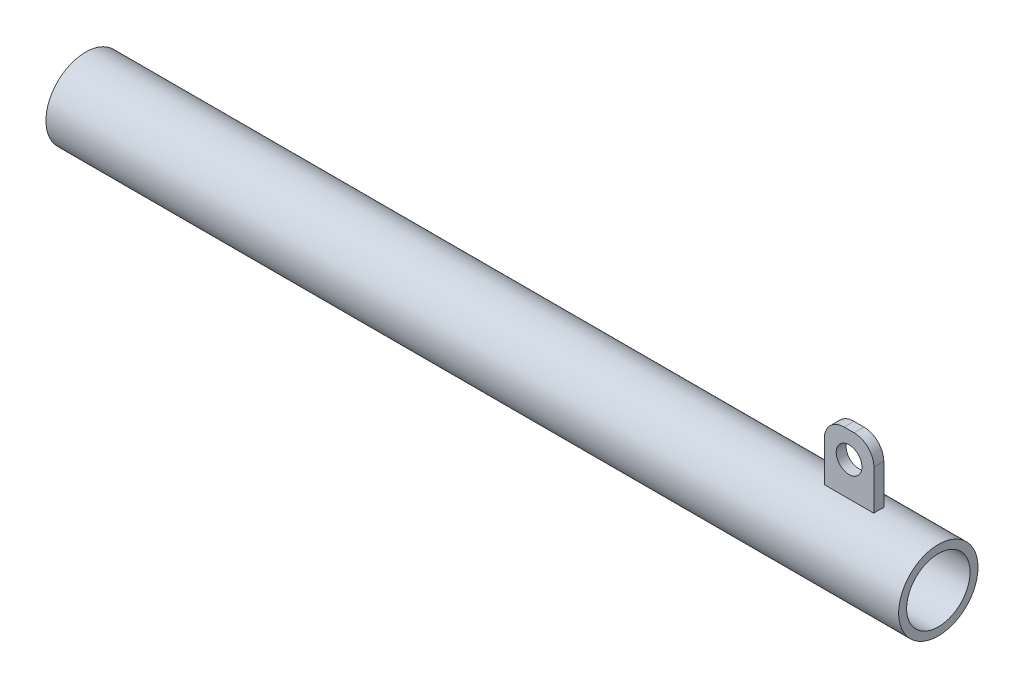
ISO-10303-21;
HEADER;
FILE_DESCRIPTION(('STEP AP214'),'2;1');
FILE_NAME('part.step','',(''),(''),'','','');
FILE_SCHEMA(('AUTOMOTIVE_DESIGN { 1 0 10303 214 1 1 1 1 }'));
ENDSEC;
DATA;
#1=APPLICATION_CONTEXT('core data for automotive mechanical design processes');
#2=APPLICATION_PROTOCOL_DEFINITION('international standard','automotive_design',2000,#1);
#3=PRODUCT_CONTEXT('',#1,'mechanical');
#4=PRODUCT('Part','Part','',(#3));
#5=PRODUCT_RELATED_PRODUCT_CATEGORY('part','',(#4));
#6=PRODUCT_DEFINITION_FORMATION('','',#4);
#7=PRODUCT_DEFINITION_CONTEXT('part definition',#1,'design');
#8=PRODUCT_DEFINITION('design','',#6,#7);
#9=PRODUCT_DEFINITION_SHAPE('','',#8);
#10=(LENGTH_UNIT() NAMED_UNIT(*) SI_UNIT(.MILLI.,.METRE.));
#11=(NAMED_UNIT(*) PLANE_ANGLE_UNIT() SI_UNIT($,.RADIAN.));
#12=(NAMED_UNIT(*) SI_UNIT($,.STERADIAN.) SOLID_ANGLE_UNIT());
#13=UNCERTAINTY_MEASURE_WITH_UNIT(LENGTH_MEASURE(1.E-05),#10,'distance_accuracy_value','');
#14=(GEOMETRIC_REPRESENTATION_CONTEXT(3) GLOBAL_UNCERTAINTY_ASSIGNED_CONTEXT((#13)) GLOBAL_UNIT_ASSIGNED_CONTEXT((#10,
#11,#12)) REPRESENTATION_CONTEXT('',''));
#15=CARTESIAN_POINT('',(0.,0.,0.));
#16=DIRECTION('',(0.,0.,1.));
#17=DIRECTION('',(1.,0.,0.));
#18=AXIS2_PLACEMENT_3D('',#15,#16,#17);
#19=CARTESIAN_POINT('',(-430.,0.,0.));
#20=DIRECTION('',(1.,0.,0.));
#21=DIRECTION('',(0.,0.,-1.));
#22=AXIS2_PLACEMENT_3D('',#19,#20,#21);
#23=CYLINDRICAL_SURFACE('',#22,20.);
#24=DIRECTION('',(1.,0.,0.));
#25=VECTOR('',#24,1.);
#26=CARTESIAN_POINT('',(-430.,19.8431348329844,-2.50000000000007));
#27=LINE('',#26,#25);
#28=CARTESIAN_POINT('',(-55.,19.8431348329844,-2.5));
#29=VERTEX_POINT('',#28);
#30=CARTESIAN_POINT('',(-30.,19.8431348329844,-2.50000000000007));
#31=VERTEX_POINT('',#30);
#32=EDGE_CURVE('E93',#29,#31,#27,.T.);
#33=ORIENTED_EDGE('',*,*,#32,.T.);
#34=CARTESIAN_POINT('',(-30.,0.,0.));
#35=DIRECTION('',(1.,0.,0.));
#36=DIRECTION('',(0.,0.,-1.));
#37=AXIS2_PLACEMENT_3D('',#34,#35,#36);
#38=CIRCLE('',#37,20.);
#39=CARTESIAN_POINT('',(-30.,19.8431348329844,2.49999999999993));
#40=VERTEX_POINT('',#39);
#41=EDGE_CURVE('E87',#31,#40,#38,.T.);
#42=ORIENTED_EDGE('',*,*,#41,.T.);
#43=DIRECTION('',(1.,0.,0.));
#44=VECTOR('',#43,1.);
#45=CARTESIAN_POINT('',(-430.,19.8431348329844,2.49999999999993));
#46=LINE('',#45,#44);
#47=CARTESIAN_POINT('',(-55.,19.8431348329844,2.49999999999993));
#48=VERTEX_POINT('',#47);
#49=EDGE_CURVE('E90',#40,#48,#46,.F.);
#50=ORIENTED_EDGE('',*,*,#49,.T.);
#51=CARTESIAN_POINT('',(-55.,0.,0.));
#52=DIRECTION('',(-1.,0.,0.));
#53=DIRECTION('',(0.,0.,1.));
#54=AXIS2_PLACEMENT_3D('',#51,#52,#53);
#55=CIRCLE('',#54,20.);
#56=EDGE_CURVE('E101',#48,#29,#55,.T.);
#57=ORIENTED_EDGE('',*,*,#56,.T.);
#58=EDGE_LOOP('',(#33,#42,#50,#57));
#59=FACE_BOUND('',#58,.T.);
#60=CARTESIAN_POINT('',(-430.,0.,0.));
#61=DIRECTION('',(1.,0.,0.));
#62=DIRECTION('',(0.,0.,-1.));
#63=AXIS2_PLACEMENT_3D('',#60,#61,#62);
#64=CIRCLE('',#63,20.);
#65=CARTESIAN_POINT('',(-430.,0.,-20.));
#66=VERTEX_POINT('',#65);
#67=EDGE_CURVE('E126',#66,#66,#64,.T.);
#68=ORIENTED_EDGE('',*,*,#67,.T.);
#69=EDGE_LOOP('',(#68));
#70=FACE_BOUND('',#69,.T.);
#71=CARTESIAN_POINT('',(0.,0.,0.));
#72=DIRECTION('',(1.,0.,0.));
#73=DIRECTION('',(0.,0.,-1.));
#74=AXIS2_PLACEMENT_3D('',#71,#72,#73);
#75=CIRCLE('',#74,20.);
#76=CARTESIAN_POINT('',(0.,0.,-20.));
#77=VERTEX_POINT('',#76);
#78=EDGE_CURVE('E123',#77,#77,#75,.T.);
#79=ORIENTED_EDGE('',*,*,#78,.F.);
#80=EDGE_LOOP('',(#79));
#81=FACE_BOUND('',#80,.T.);
#82=ADVANCED_FACE('F33',(#59,#70,#81),#23,.T.);
#83=CARTESIAN_POINT('',(-430.,0.,0.));
#84=DIRECTION('',(1.,0.,0.));
#85=DIRECTION('',(0.,0.,-1.));
#86=AXIS2_PLACEMENT_3D('',#83,#84,#85);
#87=PLANE('',#86);
#88=CARTESIAN_POINT('',(-430.,0.,0.));
#89=DIRECTION('',(1.,0.,0.));
#90=DIRECTION('',(0.,0.,-1.));
#91=AXIS2_PLACEMENT_3D('',#88,#89,#90);
#92=CIRCLE('',#91,16.);
#93=CARTESIAN_POINT('',(-430.,0.,-16.));
#94=VERTEX_POINT('',#93);
#95=EDGE_CURVE('E120',#94,#94,#92,.T.);
#96=ORIENTED_EDGE('',*,*,#95,.T.);
#97=EDGE_LOOP('',(#96));
#98=FACE_BOUND('',#97,.T.);
#99=ORIENTED_EDGE('',*,*,#67,.F.);
#100=EDGE_LOOP('',(#99));
#101=FACE_BOUND('',#100,.T.);
#102=ADVANCED_FACE('F169',(#98,#101),#87,.F.);
#103=CARTESIAN_POINT('',(0.,0.,0.));
#104=DIRECTION('',(1.,0.,0.));
#105=DIRECTION('',(0.,0.,-1.));
#106=AXIS2_PLACEMENT_3D('',#103,#104,#105);
#107=PLANE('',#106);
#108=CARTESIAN_POINT('',(0.,0.,0.));
#109=DIRECTION('',(1.,0.,0.));
#110=DIRECTION('',(0.,0.,-1.));
#111=AXIS2_PLACEMENT_3D('',#108,#109,#110);
#112=CIRCLE('',#111,16.);
#113=CARTESIAN_POINT('',(0.,0.,-16.));
#114=VERTEX_POINT('',#113);
#115=EDGE_CURVE('E118',#114,#114,#112,.T.);
#116=ORIENTED_EDGE('',*,*,#115,.F.);
#117=EDGE_LOOP('',(#116));
#118=FACE_BOUND('',#117,.T.);
#119=ORIENTED_EDGE('',*,*,#78,.T.);
#120=EDGE_LOOP('',(#119));
#121=FACE_BOUND('',#120,.T.);
#122=ADVANCED_FACE('F176',(#118,#121),#107,.T.);
#123=CARTESIAN_POINT('',(-430.,0.,0.));
#124=DIRECTION('',(1.,0.,0.));
#125=DIRECTION('',(0.,0.,-1.));
#126=AXIS2_PLACEMENT_3D('',#123,#124,#125);
#127=CYLINDRICAL_SURFACE('',#126,16.);
#128=ORIENTED_EDGE('',*,*,#95,.F.);
#129=EDGE_LOOP('',(#128));
#130=FACE_BOUND('',#129,.T.);
#131=ORIENTED_EDGE('',*,*,#115,.T.);
#132=EDGE_LOOP('',(#131));
#133=FACE_BOUND('',#132,.T.);
#134=ADVANCED_FACE('F166',(#130,#133),#127,.F.);
#135=CARTESIAN_POINT('',(-30.,-20.001,-2.5));
#136=DIRECTION('',(1.,0.,0.));
#137=DIRECTION('',(0.,0.,-1.));
#138=AXIS2_PLACEMENT_3D('',#135,#136,#137);
#139=PLANE('',#138);
#140=DIRECTION('',(0.,1.,0.));
#141=VECTOR('',#140,1.);
#142=CARTESIAN_POINT('',(-30.,-20.001,-2.5));
#143=LINE('',#142,#141);
#144=CARTESIAN_POINT('',(-30.,40.,-2.5));
#145=VERTEX_POINT('',#144);
#146=EDGE_CURVE('E113',#31,#145,#143,.T.);
#147=ORIENTED_EDGE('',*,*,#146,.T.);
#148=DIRECTION('',(0.,0.,-1.));
#149=VECTOR('',#148,1.);
#150=CARTESIAN_POINT('',(-30.,40.,-2.5));
#151=LINE('',#150,#149);
#152=CARTESIAN_POINT('',(-30.,40.,2.5));
#153=VERTEX_POINT('',#152);
#154=EDGE_CURVE('E56',#145,#153,#151,.F.);
#155=ORIENTED_EDGE('',*,*,#154,.T.);
#156=DIRECTION('',(0.,1.,0.));
#157=VECTOR('',#156,1.);
#158=CARTESIAN_POINT('',(-30.,-20.001,2.5));
#159=LINE('',#158,#157);
#160=EDGE_CURVE('E98',#40,#153,#159,.T.);
#161=ORIENTED_EDGE('',*,*,#160,.F.);
#162=ORIENTED_EDGE('',*,*,#41,.F.);
#163=EDGE_LOOP('',(#147,#155,#161,#162));
#164=FACE_BOUND('',#163,.T.);
#165=ADVANCED_FACE('F103',(#164),#139,.T.);
#166=CARTESIAN_POINT('',(-55.,-20.001,-2.5));
#167=DIRECTION('',(-1.,0.,0.));
#168=DIRECTION('',(0.,0.,1.));
#169=AXIS2_PLACEMENT_3D('',#166,#167,#168);
#170=PLANE('',#169);
#171=DIRECTION('',(0.,1.,0.));
#172=VECTOR('',#171,1.);
#173=CARTESIAN_POINT('',(-55.,-20.001,2.5));
#174=LINE('',#173,#172);
#175=CARTESIAN_POINT('',(-55.,40.,2.5));
#176=VERTEX_POINT('',#175);
#177=EDGE_CURVE('E100',#48,#176,#174,.T.);
#178=ORIENTED_EDGE('',*,*,#177,.T.);
#179=DIRECTION('',(0.,0.,1.));
#180=VECTOR('',#179,1.);
#181=CARTESIAN_POINT('',(-55.,40.,-2.5));
#182=LINE('',#181,#180);
#183=CARTESIAN_POINT('',(-55.,40.,-2.5));
#184=VERTEX_POINT('',#183);
#185=EDGE_CURVE('E11',#176,#184,#182,.F.);
#186=ORIENTED_EDGE('',*,*,#185,.T.);
#187=DIRECTION('',(0.,1.,0.));
#188=VECTOR('',#187,1.);
#189=CARTESIAN_POINT('',(-55.,-20.001,-2.5));
#190=LINE('',#189,#188);
#191=EDGE_CURVE('E105',#29,#184,#190,.T.);
#192=ORIENTED_EDGE('',*,*,#191,.F.);
#193=ORIENTED_EDGE('',*,*,#56,.F.);
#194=EDGE_LOOP('',(#178,#186,#192,#193));
#195=FACE_BOUND('',#194,.T.);
#196=ADVANCED_FACE('F157',(#195),#170,.T.);
#197=CARTESIAN_POINT('',(-55.,-20.001,-2.5));
#198=DIRECTION('',(0.,0.,-1.));
#199=DIRECTION('',(-1.,0.,0.));
#200=AXIS2_PLACEMENT_3D('',#197,#198,#199);
#201=PLANE('',#200);
#202=CARTESIAN_POINT('',(-42.5,37.,-2.5));
#203=DIRECTION('',(0.,0.,-1.));
#204=DIRECTION('',(-1.,0.,0.));
#205=AXIS2_PLACEMENT_3D('',#202,#203,#204);
#206=CIRCLE('',#205,6.5);
#207=CARTESIAN_POINT('',(-49.,37.,-2.5));
#208=VERTEX_POINT('',#207);
#209=EDGE_CURVE('E116',#208,#208,#206,.T.);
#210=ORIENTED_EDGE('',*,*,#209,.F.);
#211=EDGE_LOOP('',(#210));
#212=FACE_BOUND('',#211,.T.);
#213=DIRECTION('',(-1.,0.,0.));
#214=VECTOR('',#213,1.);
#215=CARTESIAN_POINT('',(-55.,50.,-2.5));
#216=LINE('',#215,#214);
#217=CARTESIAN_POINT('',(-40.,50.,-2.5));
#218=VERTEX_POINT('',#217);
#219=CARTESIAN_POINT('',(-45.,50.,-2.5));
#220=VERTEX_POINT('',#219);
#221=EDGE_CURVE('E104',#218,#220,#216,.T.);
#222=ORIENTED_EDGE('',*,*,#221,.F.);
#223=CARTESIAN_POINT('',(-40.,40.,-2.5));
#224=DIRECTION('',(0.,0.,-1.));
#225=DIRECTION('',(-1.,0.,0.));
#226=AXIS2_PLACEMENT_3D('',#223,#224,#225);
#227=CIRCLE('',#226,10.);
#228=EDGE_CURVE('E139',#218,#145,#227,.T.);
#229=ORIENTED_EDGE('',*,*,#228,.T.);
#230=ORIENTED_EDGE('',*,*,#146,.F.);
#231=ORIENTED_EDGE('',*,*,#32,.F.);
#232=ORIENTED_EDGE('',*,*,#191,.T.);
#233=CARTESIAN_POINT('',(-45.,40.,-2.5));
#234=DIRECTION('',(0.,0.,-1.));
#235=DIRECTION('',(-1.,0.,0.));
#236=AXIS2_PLACEMENT_3D('',#233,#234,#235);
#237=CIRCLE('',#236,10.);
#238=EDGE_CURVE('E137',#184,#220,#237,.T.);
#239=ORIENTED_EDGE('',*,*,#238,.T.);
#240=EDGE_LOOP('',(#222,#229,#230,#231,#232,#239));
#241=FACE_BOUND('',#240,.T.);
#242=ADVANCED_FACE('F151',(#212,#241),#201,.T.);
#243=CARTESIAN_POINT('',(-55.,-20.001,2.5));
#244=DIRECTION('',(0.,0.,1.));
#245=DIRECTION('',(1.,0.,0.));
#246=AXIS2_PLACEMENT_3D('',#243,#244,#245);
#247=PLANE('',#246);
#248=CARTESIAN_POINT('',(-42.5,37.,2.50000000000001));
#249=DIRECTION('',(0.,0.,1.));
#250=DIRECTION('',(1.,0.,0.));
#251=AXIS2_PLACEMENT_3D('',#248,#249,#250);
#252=CIRCLE('',#251,6.5);
#253=CARTESIAN_POINT('',(-36.,37.,2.50000000000001));
#254=VERTEX_POINT('',#253);
#255=EDGE_CURVE('E202',#254,#254,#252,.T.);
#256=ORIENTED_EDGE('',*,*,#255,.F.);
#257=EDGE_LOOP('',(#256));
#258=FACE_BOUND('',#257,.T.);
#259=ORIENTED_EDGE('',*,*,#160,.T.);
#260=CARTESIAN_POINT('',(-40.,40.,2.5));
#261=DIRECTION('',(0.,0.,1.));
#262=DIRECTION('',(1.,0.,0.));
#263=AXIS2_PLACEMENT_3D('',#260,#261,#262);
#264=CIRCLE('',#263,10.);
#265=CARTESIAN_POINT('',(-40.,50.,2.5));
#266=VERTEX_POINT('',#265);
#267=EDGE_CURVE('E41',#153,#266,#264,.T.);
#268=ORIENTED_EDGE('',*,*,#267,.T.);
#269=DIRECTION('',(1.,0.,0.));
#270=VECTOR('',#269,1.);
#271=CARTESIAN_POINT('',(-55.,50.,2.5));
#272=LINE('',#271,#270);
#273=CARTESIAN_POINT('',(-45.,50.,2.5));
#274=VERTEX_POINT('',#273);
#275=EDGE_CURVE('E95',#274,#266,#272,.T.);
#276=ORIENTED_EDGE('',*,*,#275,.F.);
#277=CARTESIAN_POINT('',(-45.,40.,2.5));
#278=DIRECTION('',(0.,0.,1.));
#279=DIRECTION('',(1.,0.,0.));
#280=AXIS2_PLACEMENT_3D('',#277,#278,#279);
#281=CIRCLE('',#280,10.);
#282=EDGE_CURVE('E48',#274,#176,#281,.T.);
#283=ORIENTED_EDGE('',*,*,#282,.T.);
#284=ORIENTED_EDGE('',*,*,#177,.F.);
#285=ORIENTED_EDGE('',*,*,#49,.F.);
#286=EDGE_LOOP('',(#259,#268,#276,#283,#284,#285));
#287=FACE_BOUND('',#286,.T.);
#288=ADVANCED_FACE('F97',(#258,#287),#247,.T.);
#289=CARTESIAN_POINT('',(0.,50.,0.));
#290=DIRECTION('',(0.,1.,0.));
#291=DIRECTION('',(0.,0.,1.));
#292=AXIS2_PLACEMENT_3D('',#289,#290,#291);
#293=PLANE('',#292);
#294=ORIENTED_EDGE('',*,*,#275,.T.);
#295=DIRECTION('',(0.,0.,-1.));
#296=VECTOR('',#295,1.);
#297=CARTESIAN_POINT('',(-40.,50.,0.));
#298=LINE('',#297,#296);
#299=EDGE_CURVE('E134',#266,#218,#298,.T.);
#300=ORIENTED_EDGE('',*,*,#299,.T.);
#301=ORIENTED_EDGE('',*,*,#221,.T.);
#302=DIRECTION('',(0.,0.,1.));
#303=VECTOR('',#302,1.);
#304=CARTESIAN_POINT('',(-45.,50.,0.));
#305=LINE('',#304,#303);
#306=EDGE_CURVE('E129',#220,#274,#305,.T.);
#307=ORIENTED_EDGE('',*,*,#306,.T.);
#308=EDGE_LOOP('',(#294,#300,#301,#307));
#309=FACE_BOUND('',#308,.T.);
#310=ADVANCED_FACE('F146',(#309),#293,.T.);
#311=CARTESIAN_POINT('',(-40.,40.,0.));
#312=DIRECTION('',(0.,0.,-1.));
#313=DIRECTION('',(-1.,0.,0.));
#314=AXIS2_PLACEMENT_3D('',#311,#312,#313);
#315=CYLINDRICAL_SURFACE('',#314,10.);
#316=ORIENTED_EDGE('',*,*,#267,.F.);
#317=ORIENTED_EDGE('',*,*,#154,.F.);
#318=ORIENTED_EDGE('',*,*,#228,.F.);
#319=ORIENTED_EDGE('',*,*,#299,.F.);
#320=EDGE_LOOP('',(#316,#317,#318,#319));
#321=FACE_BOUND('',#320,.T.);
#322=ADVANCED_FACE('F149',(#321),#315,.T.);
#323=CARTESIAN_POINT('',(-45.,40.,0.));
#324=DIRECTION('',(0.,0.,1.));
#325=DIRECTION('',(1.,0.,0.));
#326=AXIS2_PLACEMENT_3D('',#323,#324,#325);
#327=CYLINDRICAL_SURFACE('',#326,10.);
#328=ORIENTED_EDGE('',*,*,#238,.F.);
#329=ORIENTED_EDGE('',*,*,#185,.F.);
#330=ORIENTED_EDGE('',*,*,#282,.F.);
#331=ORIENTED_EDGE('',*,*,#306,.F.);
#332=EDGE_LOOP('',(#328,#329,#330,#331));
#333=FACE_BOUND('',#332,.T.);
#334=ADVANCED_FACE('F35',(#333),#327,.T.);
#335=CARTESIAN_POINT('',(-42.5,37.,-7.49999999999999));
#336=DIRECTION('',(0.,0.,1.));
#337=DIRECTION('',(1.,0.,0.));
#338=AXIS2_PLACEMENT_3D('',#335,#336,#337);
#339=CYLINDRICAL_SURFACE('',#338,6.5);
#340=ORIENTED_EDGE('',*,*,#209,.T.);
#341=EDGE_LOOP('',(#340));
#342=FACE_BOUND('',#341,.T.);
#343=ORIENTED_EDGE('',*,*,#255,.T.);
#344=EDGE_LOOP('',(#343));
#345=FACE_BOUND('',#344,.T.);
#346=ADVANCED_FACE('F185',(#342,#345),#339,.F.);
#347=CLOSED_SHELL('',(#82,#102,#122,#134,#165,#196,#242,#288,#310,#322,#334,#346));
#348=MANIFOLD_SOLID_BREP('B2',#347);
#349=ADVANCED_BREP_SHAPE_REPRESENTATION('',(#18,#348),#14);
#350=SHAPE_DEFINITION_REPRESENTATION(#9,#349);
ENDSEC;
END-ISO-10303-21;
